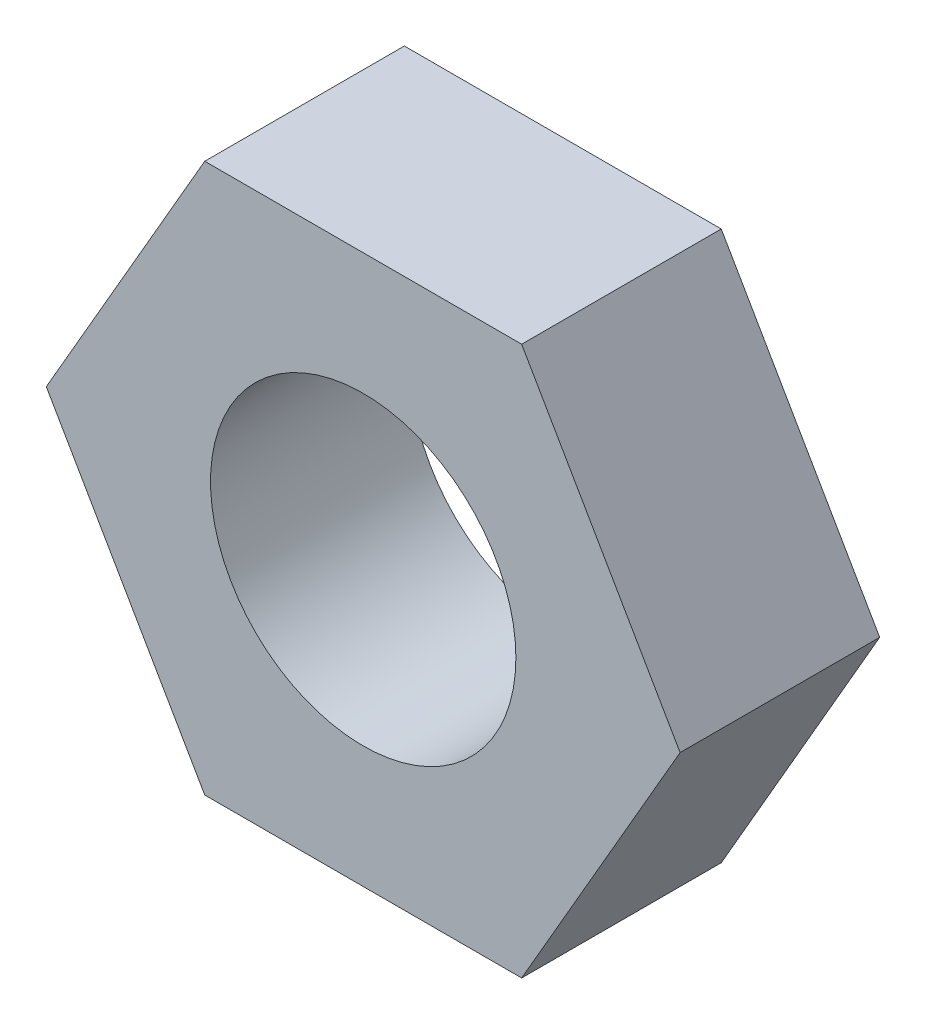
ISO-10303-21;
HEADER;
FILE_DESCRIPTION(('STEP AP214'),'2;1');
FILE_NAME('part.step','',(''),(''),'','','');
FILE_SCHEMA(('AUTOMOTIVE_DESIGN { 1 0 10303 214 1 1 1 1 }'));
ENDSEC;
DATA;
#1=APPLICATION_CONTEXT('core data for automotive mechanical design processes');
#2=APPLICATION_PROTOCOL_DEFINITION('international standard','automotive_design',2000,#1);
#3=PRODUCT_CONTEXT('',#1,'mechanical');
#4=PRODUCT('Part','Part','',(#3));
#5=PRODUCT_RELATED_PRODUCT_CATEGORY('part','',(#4));
#6=PRODUCT_DEFINITION_FORMATION('','',#4);
#7=PRODUCT_DEFINITION_CONTEXT('part definition',#1,'design');
#8=PRODUCT_DEFINITION('design','',#6,#7);
#9=PRODUCT_DEFINITION_SHAPE('','',#8);
#10=(LENGTH_UNIT() NAMED_UNIT(*) SI_UNIT(.MILLI.,.METRE.));
#11=(NAMED_UNIT(*) PLANE_ANGLE_UNIT() SI_UNIT($,.RADIAN.));
#12=(NAMED_UNIT(*) SI_UNIT($,.STERADIAN.) SOLID_ANGLE_UNIT());
#13=UNCERTAINTY_MEASURE_WITH_UNIT(LENGTH_MEASURE(1.E-05),#10,'distance_accuracy_value','');
#14=(GEOMETRIC_REPRESENTATION_CONTEXT(3) GLOBAL_UNCERTAINTY_ASSIGNED_CONTEXT((#13)) GLOBAL_UNIT_ASSIGNED_CONTEXT((#10,
#11,#12)) REPRESENTATION_CONTEXT('',''));
#15=CARTESIAN_POINT('',(0.,0.,0.));
#16=DIRECTION('',(0.,0.,1.));
#17=DIRECTION('',(1.,0.,0.));
#18=AXIS2_PLACEMENT_3D('',#15,#16,#17);
#19=CARTESIAN_POINT('',(0.,0.,2.));
#20=DIRECTION('',(0.,0.,1.));
#21=DIRECTION('',(1.,0.,0.));
#22=AXIS2_PLACEMENT_3D('',#19,#20,#21);
#23=PLANE('',#22);
#24=DIRECTION('',(0.5,0.866025403784438,0.));
#25=VECTOR('',#24,1.);
#26=CARTESIAN_POINT('',(1.58771324027147,-2.75,2.));
#27=LINE('',#26,#25);
#28=CARTESIAN_POINT('',(1.58771324027147,-2.75,2.));
#29=VERTEX_POINT('',#28);
#30=CARTESIAN_POINT('',(3.17542648054294,0.,2.));
#31=VERTEX_POINT('',#30);
#32=EDGE_CURVE('E133',#29,#31,#27,.T.);
#33=ORIENTED_EDGE('',*,*,#32,.T.);
#34=DIRECTION('',(-0.5,0.866025403784438,0.));
#35=VECTOR('',#34,1.);
#36=CARTESIAN_POINT('',(3.17542648054294,0.,2.));
#37=LINE('',#36,#35);
#38=CARTESIAN_POINT('',(1.58771324027147,2.75,2.));
#39=VERTEX_POINT('',#38);
#40=EDGE_CURVE('E91',#31,#39,#37,.T.);
#41=ORIENTED_EDGE('',*,*,#40,.T.);
#42=DIRECTION('',(-1.,0.,0.));
#43=VECTOR('',#42,1.);
#44=CARTESIAN_POINT('',(1.58771324027147,2.75,2.));
#45=LINE('',#44,#43);
#46=CARTESIAN_POINT('',(-1.58771324027147,2.75,2.));
#47=VERTEX_POINT('',#46);
#48=EDGE_CURVE('E106',#39,#47,#45,.T.);
#49=ORIENTED_EDGE('',*,*,#48,.T.);
#50=DIRECTION('',(-0.5,-0.866025403784439,0.));
#51=VECTOR('',#50,1.);
#52=CARTESIAN_POINT('',(-1.58771324027147,2.75,2.));
#53=LINE('',#52,#51);
#54=CARTESIAN_POINT('',(-3.17542648054294,0.,2.));
#55=VERTEX_POINT('',#54);
#56=EDGE_CURVE('E99',#47,#55,#53,.T.);
#57=ORIENTED_EDGE('',*,*,#56,.T.);
#58=DIRECTION('',(0.5,-0.866025403784439,0.));
#59=VECTOR('',#58,1.);
#60=CARTESIAN_POINT('',(-3.17542648054294,0.,2.));
#61=LINE('',#60,#59);
#62=CARTESIAN_POINT('',(-1.58771324027147,-2.75,2.));
#63=VERTEX_POINT('',#62);
#64=EDGE_CURVE('E102',#55,#63,#61,.T.);
#65=ORIENTED_EDGE('',*,*,#64,.T.);
#66=DIRECTION('',(1.,0.,0.));
#67=VECTOR('',#66,1.);
#68=CARTESIAN_POINT('',(-1.58771324027147,-2.75,2.));
#69=LINE('',#68,#67);
#70=EDGE_CURVE('E57',#63,#29,#69,.T.);
#71=ORIENTED_EDGE('',*,*,#70,.T.);
#72=EDGE_LOOP('',(#33,#41,#49,#57,#65,#71));
#73=FACE_BOUND('',#72,.T.);
#74=CARTESIAN_POINT('',(0.,0.,2.));
#75=DIRECTION('',(0.,0.,1.));
#76=DIRECTION('',(1.,0.,0.));
#77=AXIS2_PLACEMENT_3D('',#74,#75,#76);
#78=CIRCLE('',#77,1.53);
#79=CARTESIAN_POINT('',(1.53,0.,2.));
#80=VERTEX_POINT('',#79);
#81=EDGE_CURVE('E126',#80,#80,#78,.T.);
#82=ORIENTED_EDGE('',*,*,#81,.F.);
#83=EDGE_LOOP('',(#82));
#84=FACE_BOUND('',#83,.T.);
#85=ADVANCED_FACE('F39',(#73,#84),#23,.T.);
#86=CARTESIAN_POINT('',(0.,0.,0.));
#87=DIRECTION('',(0.,0.,1.));
#88=DIRECTION('',(1.,0.,0.));
#89=AXIS2_PLACEMENT_3D('',#86,#87,#88);
#90=PLANE('',#89);
#91=DIRECTION('',(0.5,0.866025403784438,0.));
#92=VECTOR('',#91,1.);
#93=CARTESIAN_POINT('',(1.58771324027147,-2.75,0.));
#94=LINE('',#93,#92);
#95=CARTESIAN_POINT('',(1.58771324027147,-2.75,0.));
#96=VERTEX_POINT('',#95);
#97=CARTESIAN_POINT('',(3.17542648054294,0.,0.));
#98=VERTEX_POINT('',#97);
#99=EDGE_CURVE('E123',#96,#98,#94,.T.);
#100=ORIENTED_EDGE('',*,*,#99,.F.);
#101=DIRECTION('',(1.,0.,0.));
#102=VECTOR('',#101,1.);
#103=CARTESIAN_POINT('',(-1.58771324027147,-2.75,0.));
#104=LINE('',#103,#102);
#105=CARTESIAN_POINT('',(-1.58771324027147,-2.75,0.));
#106=VERTEX_POINT('',#105);
#107=EDGE_CURVE('E84',#106,#96,#104,.T.);
#108=ORIENTED_EDGE('',*,*,#107,.F.);
#109=DIRECTION('',(0.5,-0.866025403784439,0.));
#110=VECTOR('',#109,1.);
#111=CARTESIAN_POINT('',(-3.17542648054294,0.,0.));
#112=LINE('',#111,#110);
#113=CARTESIAN_POINT('',(-3.17542648054294,0.,0.));
#114=VERTEX_POINT('',#113);
#115=EDGE_CURVE('E76',#114,#106,#112,.T.);
#116=ORIENTED_EDGE('',*,*,#115,.F.);
#117=DIRECTION('',(-0.5,-0.866025403784439,0.));
#118=VECTOR('',#117,1.);
#119=CARTESIAN_POINT('',(-1.58771324027147,2.75,0.));
#120=LINE('',#119,#118);
#121=CARTESIAN_POINT('',(-1.58771324027147,2.75,0.));
#122=VERTEX_POINT('',#121);
#123=EDGE_CURVE('E111',#122,#114,#120,.T.);
#124=ORIENTED_EDGE('',*,*,#123,.F.);
#125=DIRECTION('',(-1.,0.,0.));
#126=VECTOR('',#125,1.);
#127=CARTESIAN_POINT('',(1.58771324027147,2.75,0.));
#128=LINE('',#127,#126);
#129=CARTESIAN_POINT('',(1.58771324027147,2.75,0.));
#130=VERTEX_POINT('',#129);
#131=EDGE_CURVE('E128',#130,#122,#128,.T.);
#132=ORIENTED_EDGE('',*,*,#131,.F.);
#133=DIRECTION('',(-0.5,0.866025403784438,0.));
#134=VECTOR('',#133,1.);
#135=CARTESIAN_POINT('',(3.17542648054294,0.,0.));
#136=LINE('',#135,#134);
#137=EDGE_CURVE('E130',#98,#130,#136,.T.);
#138=ORIENTED_EDGE('',*,*,#137,.F.);
#139=EDGE_LOOP('',(#100,#108,#116,#124,#132,#138));
#140=FACE_BOUND('',#139,.T.);
#141=CARTESIAN_POINT('',(0.,0.,0.));
#142=DIRECTION('',(0.,0.,1.));
#143=DIRECTION('',(1.,0.,0.));
#144=AXIS2_PLACEMENT_3D('',#141,#142,#143);
#145=CIRCLE('',#144,1.53);
#146=CARTESIAN_POINT('',(1.53,0.,0.));
#147=VERTEX_POINT('',#146);
#148=EDGE_CURVE('E229',#147,#147,#145,.T.);
#149=ORIENTED_EDGE('',*,*,#148,.T.);
#150=EDGE_LOOP('',(#149));
#151=FACE_BOUND('',#150,.T.);
#152=ADVANCED_FACE('F145',(#140,#151),#90,.F.);
#153=CARTESIAN_POINT('',(1.58771324027147,-2.75,2.));
#154=DIRECTION('',(-0.866025403784439,0.5,0.));
#155=DIRECTION('',(-0.5,-0.866025403784439,0.));
#156=AXIS2_PLACEMENT_3D('',#153,#154,#155);
#157=PLANE('',#156);
#158=ORIENTED_EDGE('',*,*,#99,.T.);
#159=DIRECTION('',(0.,0.,-1.));
#160=VECTOR('',#159,1.);
#161=CARTESIAN_POINT('',(3.17542648054294,0.,2.));
#162=LINE('',#161,#160);
#163=EDGE_CURVE('E11',#31,#98,#162,.T.);
#164=ORIENTED_EDGE('',*,*,#163,.F.);
#165=ORIENTED_EDGE('',*,*,#32,.F.);
#166=DIRECTION('',(0.,0.,-1.));
#167=VECTOR('',#166,1.);
#168=CARTESIAN_POINT('',(1.58771324027147,-2.75,2.));
#169=LINE('',#168,#167);
#170=EDGE_CURVE('E118',#29,#96,#169,.T.);
#171=ORIENTED_EDGE('',*,*,#170,.T.);
#172=EDGE_LOOP('',(#158,#164,#165,#171));
#173=FACE_BOUND('',#172,.T.);
#174=ADVANCED_FACE('F41',(#173),#157,.F.);
#175=CARTESIAN_POINT('',(3.17542648054294,0.,2.));
#176=DIRECTION('',(-0.866025403784439,-0.5,0.));
#177=DIRECTION('',(0.5,-0.866025403784439,0.));
#178=AXIS2_PLACEMENT_3D('',#175,#176,#177);
#179=PLANE('',#178);
#180=ORIENTED_EDGE('',*,*,#137,.T.);
#181=DIRECTION('',(0.,0.,-1.));
#182=VECTOR('',#181,1.);
#183=CARTESIAN_POINT('',(1.58771324027147,2.75,2.));
#184=LINE('',#183,#182);
#185=EDGE_CURVE('E48',#39,#130,#184,.T.);
#186=ORIENTED_EDGE('',*,*,#185,.F.);
#187=ORIENTED_EDGE('',*,*,#40,.F.);
#188=ORIENTED_EDGE('',*,*,#163,.T.);
#189=EDGE_LOOP('',(#180,#186,#187,#188));
#190=FACE_BOUND('',#189,.T.);
#191=ADVANCED_FACE('F166',(#190),#179,.F.);
#192=CARTESIAN_POINT('',(1.58771324027147,2.75,2.));
#193=DIRECTION('',(0.,-1.,0.));
#194=DIRECTION('',(1.,0.,0.));
#195=AXIS2_PLACEMENT_3D('',#192,#193,#194);
#196=PLANE('',#195);
#197=ORIENTED_EDGE('',*,*,#131,.T.);
#198=DIRECTION('',(0.,0.,-1.));
#199=VECTOR('',#198,1.);
#200=CARTESIAN_POINT('',(-1.58771324027147,2.75,2.));
#201=LINE('',#200,#199);
#202=EDGE_CURVE('E113',#47,#122,#201,.T.);
#203=ORIENTED_EDGE('',*,*,#202,.F.);
#204=ORIENTED_EDGE('',*,*,#48,.F.);
#205=ORIENTED_EDGE('',*,*,#185,.T.);
#206=EDGE_LOOP('',(#197,#203,#204,#205));
#207=FACE_BOUND('',#206,.T.);
#208=ADVANCED_FACE('F143',(#207),#196,.F.);
#209=CARTESIAN_POINT('',(-1.58771324027147,2.75,2.));
#210=DIRECTION('',(0.866025403784439,-0.5,0.));
#211=DIRECTION('',(0.5,0.866025403784439,0.));
#212=AXIS2_PLACEMENT_3D('',#209,#210,#211);
#213=PLANE('',#212);
#214=ORIENTED_EDGE('',*,*,#123,.T.);
#215=DIRECTION('',(0.,0.,-1.));
#216=VECTOR('',#215,1.);
#217=CARTESIAN_POINT('',(-3.17542648054294,0.,2.));
#218=LINE('',#217,#216);
#219=EDGE_CURVE('E112',#55,#114,#218,.T.);
#220=ORIENTED_EDGE('',*,*,#219,.F.);
#221=ORIENTED_EDGE('',*,*,#56,.F.);
#222=ORIENTED_EDGE('',*,*,#202,.T.);
#223=EDGE_LOOP('',(#214,#220,#221,#222));
#224=FACE_BOUND('',#223,.T.);
#225=ADVANCED_FACE('F115',(#224),#213,.F.);
#226=CARTESIAN_POINT('',(-3.17542648054294,0.,2.));
#227=DIRECTION('',(0.866025403784439,0.5,0.));
#228=DIRECTION('',(-0.5,0.866025403784439,0.));
#229=AXIS2_PLACEMENT_3D('',#226,#227,#228);
#230=PLANE('',#229);
#231=ORIENTED_EDGE('',*,*,#115,.T.);
#232=DIRECTION('',(0.,0.,-1.));
#233=VECTOR('',#232,1.);
#234=CARTESIAN_POINT('',(-1.58771324027147,-2.75,2.));
#235=LINE('',#234,#233);
#236=EDGE_CURVE('E117',#63,#106,#235,.T.);
#237=ORIENTED_EDGE('',*,*,#236,.F.);
#238=ORIENTED_EDGE('',*,*,#64,.F.);
#239=ORIENTED_EDGE('',*,*,#219,.T.);
#240=EDGE_LOOP('',(#231,#237,#238,#239));
#241=FACE_BOUND('',#240,.T.);
#242=ADVANCED_FACE('F119',(#241),#230,.F.);
#243=CARTESIAN_POINT('',(-1.58771324027147,-2.75,2.));
#244=DIRECTION('',(0.,1.,0.));
#245=DIRECTION('',(-1.,0.,0.));
#246=AXIS2_PLACEMENT_3D('',#243,#244,#245);
#247=PLANE('',#246);
#248=ORIENTED_EDGE('',*,*,#107,.T.);
#249=ORIENTED_EDGE('',*,*,#170,.F.);
#250=ORIENTED_EDGE('',*,*,#70,.F.);
#251=ORIENTED_EDGE('',*,*,#236,.T.);
#252=EDGE_LOOP('',(#248,#249,#250,#251));
#253=FACE_BOUND('',#252,.T.);
#254=ADVANCED_FACE('F149',(#253),#247,.F.);
#255=CARTESIAN_POINT('',(0.,0.,2.));
#256=DIRECTION('',(0.,0.,-1.));
#257=DIRECTION('',(-1.,0.,0.));
#258=AXIS2_PLACEMENT_3D('',#255,#256,#257);
#259=CYLINDRICAL_SURFACE('',#258,1.53);
#260=ORIENTED_EDGE('',*,*,#81,.T.);
#261=EDGE_LOOP('',(#260));
#262=FACE_BOUND('',#261,.T.);
#263=ORIENTED_EDGE('',*,*,#148,.F.);
#264=EDGE_LOOP('',(#263));
#265=FACE_BOUND('',#264,.T.);
#266=ADVANCED_FACE('F151',(#262,#265),#259,.F.);
#267=CLOSED_SHELL('',(#85,#152,#174,#191,#208,#225,#242,#254,#266));
#268=MANIFOLD_SOLID_BREP('B2',#267);
#269=ADVANCED_BREP_SHAPE_REPRESENTATION('',(#18,#268),#14);
#270=SHAPE_DEFINITION_REPRESENTATION(#9,#269);
ENDSEC;
END-ISO-10303-21;
